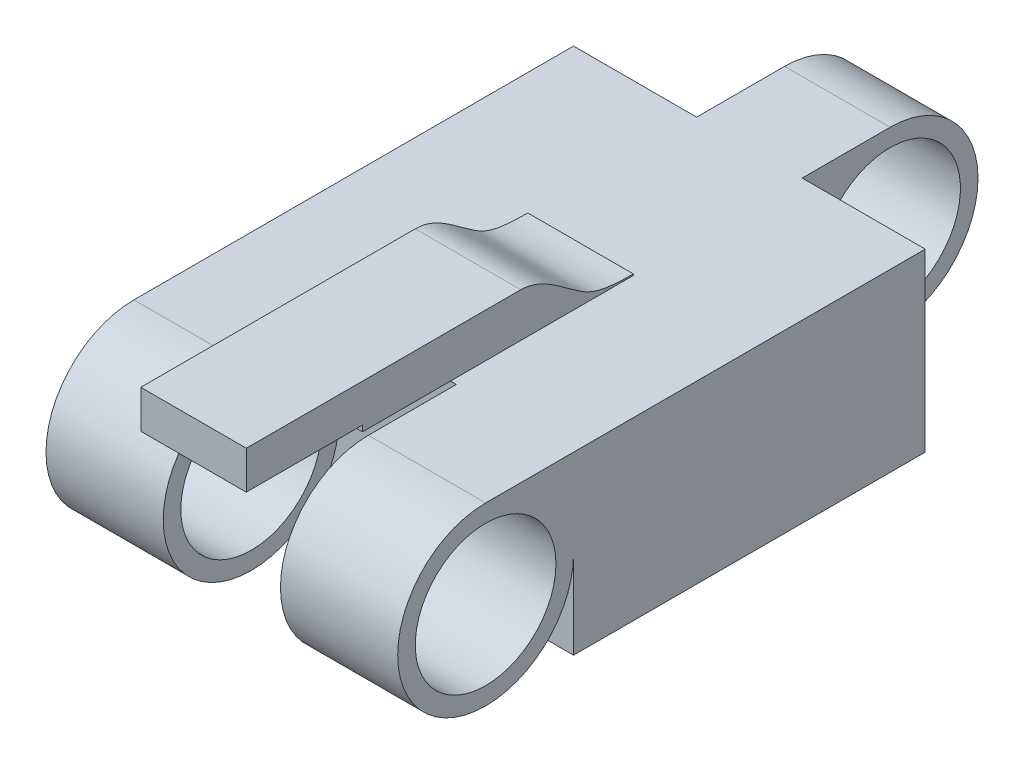
ISO-10303-21;
HEADER;
FILE_DESCRIPTION(('STEP AP214'),'2;1');
FILE_NAME('part.step','',(''),(''),'','','');
FILE_SCHEMA(('AUTOMOTIVE_DESIGN { 1 0 10303 214 1 1 1 1 }'));
ENDSEC;
DATA;
#1=APPLICATION_CONTEXT('core data for automotive mechanical design processes');
#2=APPLICATION_PROTOCOL_DEFINITION('international standard','automotive_design',2000,#1);
#3=PRODUCT_CONTEXT('',#1,'mechanical');
#4=PRODUCT('Part','Part','',(#3));
#5=PRODUCT_RELATED_PRODUCT_CATEGORY('part','',(#4));
#6=PRODUCT_DEFINITION_FORMATION('','',#4);
#7=PRODUCT_DEFINITION_CONTEXT('part definition',#1,'design');
#8=PRODUCT_DEFINITION('design','',#6,#7);
#9=PRODUCT_DEFINITION_SHAPE('','',#8);
#10=(LENGTH_UNIT() NAMED_UNIT(*) SI_UNIT(.MILLI.,.METRE.));
#11=(NAMED_UNIT(*) PLANE_ANGLE_UNIT() SI_UNIT($,.RADIAN.));
#12=(NAMED_UNIT(*) SI_UNIT($,.STERADIAN.) SOLID_ANGLE_UNIT());
#13=UNCERTAINTY_MEASURE_WITH_UNIT(LENGTH_MEASURE(1.E-05),#10,'distance_accuracy_value','');
#14=(GEOMETRIC_REPRESENTATION_CONTEXT(3) GLOBAL_UNCERTAINTY_ASSIGNED_CONTEXT((#13)) GLOBAL_UNIT_ASSIGNED_CONTEXT((#10,
#11,#12)) REPRESENTATION_CONTEXT('',''));
#15=CARTESIAN_POINT('',(0.,0.,0.));
#16=DIRECTION('',(0.,0.,1.));
#17=DIRECTION('',(1.,0.,0.));
#18=AXIS2_PLACEMENT_3D('',#15,#16,#17);
#19=CARTESIAN_POINT('',(10.,0.,-10.));
#20=DIRECTION('',(0.,0.,1.));
#21=DIRECTION('',(1.,0.,0.));
#22=AXIS2_PLACEMENT_3D('',#19,#20,#21);
#23=PLANE('',#22);
#24=DIRECTION('',(0.,1.,0.));
#25=VECTOR('',#24,1.);
#26=CARTESIAN_POINT('',(6.5,5.,-10.));
#27=LINE('',#26,#25);
#28=CARTESIAN_POINT('',(6.5,2.5,-10.));
#29=VERTEX_POINT('',#28);
#30=CARTESIAN_POINT('',(6.5,5.,-10.));
#31=VERTEX_POINT('',#30);
#32=EDGE_CURVE('E401',#29,#31,#27,.T.);
#33=ORIENTED_EDGE('',*,*,#32,.T.);
#34=DIRECTION('',(-1.,0.,0.));
#35=VECTOR('',#34,1.);
#36=CARTESIAN_POINT('',(10.,5.,-10.));
#37=LINE('',#36,#35);
#38=CARTESIAN_POINT('',(10.,5.,-10.));
#39=VERTEX_POINT('',#38);
#40=EDGE_CURVE('E352',#39,#31,#37,.T.);
#41=ORIENTED_EDGE('',*,*,#40,.F.);
#42=DIRECTION('',(0.,1.,0.));
#43=VECTOR('',#42,1.);
#44=CARTESIAN_POINT('',(10.,0.,-10.));
#45=LINE('',#44,#43);
#46=CARTESIAN_POINT('',(10.,0.,-10.));
#47=VERTEX_POINT('',#46);
#48=EDGE_CURVE('E350',#47,#39,#45,.T.);
#49=ORIENTED_EDGE('',*,*,#48,.F.);
#50=DIRECTION('',(-1.,0.,0.));
#51=VECTOR('',#50,1.);
#52=CARTESIAN_POINT('',(10.,0.,-10.));
#53=LINE('',#52,#51);
#54=CARTESIAN_POINT('',(0.,0.,-10.));
#55=VERTEX_POINT('',#54);
#56=EDGE_CURVE('E53',#47,#55,#53,.T.);
#57=ORIENTED_EDGE('',*,*,#56,.T.);
#58=DIRECTION('',(0.,1.,0.));
#59=VECTOR('',#58,1.);
#60=CARTESIAN_POINT('',(0.,0.,-10.));
#61=LINE('',#60,#59);
#62=CARTESIAN_POINT('',(0.,5.,-10.));
#63=VERTEX_POINT('',#62);
#64=EDGE_CURVE('E342',#55,#63,#61,.T.);
#65=ORIENTED_EDGE('',*,*,#64,.T.);
#66=CARTESIAN_POINT('',(3.5,5.,-10.));
#67=VERTEX_POINT('',#66);
#68=EDGE_CURVE('E367',#67,#63,#37,.T.);
#69=ORIENTED_EDGE('',*,*,#68,.F.);
#70=DIRECTION('',(0.,1.,0.));
#71=VECTOR('',#70,1.);
#72=CARTESIAN_POINT('',(3.5,5.,-10.));
#73=LINE('',#72,#71);
#74=CARTESIAN_POINT('',(3.5,2.5,-10.));
#75=VERTEX_POINT('',#74);
#76=EDGE_CURVE('E381',#75,#67,#73,.T.);
#77=ORIENTED_EDGE('',*,*,#76,.F.);
#78=DIRECTION('',(-1.,0.,0.));
#79=VECTOR('',#78,1.);
#80=CARTESIAN_POINT('',(6.5,2.5,-10.));
#81=LINE('',#80,#79);
#82=EDGE_CURVE('E382',#29,#75,#81,.T.);
#83=ORIENTED_EDGE('',*,*,#82,.F.);
#84=EDGE_LOOP('',(#33,#41,#49,#57,#65,#69,#77,#83));
#85=FACE_BOUND('',#84,.T.);
#86=ADVANCED_FACE('F44',(#85),#23,.F.);
#87=CARTESIAN_POINT('',(10.,0.,0.));
#88=DIRECTION('',(0.,0.,-1.));
#89=DIRECTION('',(-1.,0.,0.));
#90=AXIS2_PLACEMENT_3D('',#87,#88,#89);
#91=PLANE('',#90);
#92=DIRECTION('',(1.,0.,0.));
#93=VECTOR('',#92,1.);
#94=CARTESIAN_POINT('',(6.66666666666667,2.5,0.));
#95=LINE('',#94,#93);
#96=CARTESIAN_POINT('',(6.66666666666667,2.5,0.));
#97=VERTEX_POINT('',#96);
#98=CARTESIAN_POINT('',(10.,2.5,0.));
#99=VERTEX_POINT('',#98);
#100=EDGE_CURVE('E437',#97,#99,#95,.T.);
#101=ORIENTED_EDGE('',*,*,#100,.F.);
#102=DIRECTION('',(0.,1.,0.));
#103=VECTOR('',#102,1.);
#104=CARTESIAN_POINT('',(6.66666666666667,5.,0.));
#105=LINE('',#104,#103);
#106=CARTESIAN_POINT('',(6.66666666666667,5.,0.));
#107=VERTEX_POINT('',#106);
#108=EDGE_CURVE('E429',#97,#107,#105,.T.);
#109=ORIENTED_EDGE('',*,*,#108,.T.);
#110=DIRECTION('',(-1.,0.,0.));
#111=VECTOR('',#110,1.);
#112=CARTESIAN_POINT('',(10.,5.,0.));
#113=LINE('',#112,#111);
#114=CARTESIAN_POINT('',(6.5,5.,0.));
#115=VERTEX_POINT('',#114);
#116=EDGE_CURVE('E363',#107,#115,#113,.T.);
#117=ORIENTED_EDGE('',*,*,#116,.T.);
#118=CARTESIAN_POINT('',(3.5,5.,0.));
#119=VERTEX_POINT('',#118);
#120=EDGE_CURVE('E368',#115,#119,#113,.T.);
#121=ORIENTED_EDGE('',*,*,#120,.T.);
#122=CARTESIAN_POINT('',(3.33333333333333,5.,0.));
#123=VERTEX_POINT('',#122);
#124=EDGE_CURVE('E369',#119,#123,#113,.T.);
#125=ORIENTED_EDGE('',*,*,#124,.T.);
#126=DIRECTION('',(0.,-1.,0.));
#127=VECTOR('',#126,1.);
#128=CARTESIAN_POINT('',(3.33333333333333,5.,0.));
#129=LINE('',#128,#127);
#130=CARTESIAN_POINT('',(3.33333333333333,2.5,0.));
#131=VERTEX_POINT('',#130);
#132=EDGE_CURVE('E464',#123,#131,#129,.T.);
#133=ORIENTED_EDGE('',*,*,#132,.T.);
#134=DIRECTION('',(-1.,0.,0.));
#135=VECTOR('',#134,1.);
#136=CARTESIAN_POINT('',(3.33333333333333,2.5,0.));
#137=LINE('',#136,#135);
#138=CARTESIAN_POINT('',(0.,2.5,0.));
#139=VERTEX_POINT('',#138);
#140=EDGE_CURVE('E470',#131,#139,#137,.T.);
#141=ORIENTED_EDGE('',*,*,#140,.T.);
#142=DIRECTION('',(0.,-1.,0.));
#143=VECTOR('',#142,1.);
#144=CARTESIAN_POINT('',(0.,0.,0.));
#145=LINE('',#144,#143);
#146=CARTESIAN_POINT('',(0.,0.,0.));
#147=VERTEX_POINT('',#146);
#148=EDGE_CURVE('E343',#139,#147,#145,.T.);
#149=ORIENTED_EDGE('',*,*,#148,.T.);
#150=DIRECTION('',(-1.,0.,0.));
#151=VECTOR('',#150,1.);
#152=CARTESIAN_POINT('',(10.,0.,0.));
#153=LINE('',#152,#151);
#154=CARTESIAN_POINT('',(10.,0.,0.));
#155=VERTEX_POINT('',#154);
#156=EDGE_CURVE('E11',#155,#147,#153,.T.);
#157=ORIENTED_EDGE('',*,*,#156,.F.);
#158=DIRECTION('',(0.,-1.,0.));
#159=VECTOR('',#158,1.);
#160=CARTESIAN_POINT('',(10.,0.,0.));
#161=LINE('',#160,#159);
#162=EDGE_CURVE('E359',#99,#155,#161,.T.);
#163=ORIENTED_EDGE('',*,*,#162,.F.);
#164=EDGE_LOOP('',(#101,#109,#117,#121,#125,#133,#141,#149,#157,#163));
#165=FACE_BOUND('',#164,.T.);
#166=ADVANCED_FACE('F46',(#165),#91,.F.);
#167=CARTESIAN_POINT('',(10.,0.,0.));
#168=DIRECTION('',(0.,1.,0.));
#169=DIRECTION('',(0.,0.,1.));
#170=AXIS2_PLACEMENT_3D('',#167,#168,#169);
#171=PLANE('',#170);
#172=DIRECTION('',(0.,0.,-1.));
#173=VECTOR('',#172,1.);
#174=CARTESIAN_POINT('',(0.,0.,0.));
#175=LINE('',#174,#173);
#176=EDGE_CURVE('E335',#147,#55,#175,.T.);
#177=ORIENTED_EDGE('',*,*,#176,.T.);
#178=ORIENTED_EDGE('',*,*,#56,.F.);
#179=DIRECTION('',(0.,0.,-1.));
#180=VECTOR('',#179,1.);
#181=CARTESIAN_POINT('',(10.,0.,0.));
#182=LINE('',#181,#180);
#183=EDGE_CURVE('E478',#155,#47,#182,.T.);
#184=ORIENTED_EDGE('',*,*,#183,.F.);
#185=ORIENTED_EDGE('',*,*,#156,.T.);
#186=EDGE_LOOP('',(#177,#178,#184,#185));
#187=FACE_BOUND('',#186,.T.);
#188=ADVANCED_FACE('F324',(#187),#171,.F.);
#189=CARTESIAN_POINT('',(10.,5.,0.));
#190=DIRECTION('',(0.,-1.,0.));
#191=DIRECTION('',(0.,0.,-1.));
#192=AXIS2_PLACEMENT_3D('',#189,#190,#191);
#193=PLANE('',#192);
#194=DIRECTION('',(-1.,0.,0.));
#195=VECTOR('',#194,1.);
#196=CARTESIAN_POINT('',(6.5,5.,-5.2));
#197=LINE('',#196,#195);
#198=CARTESIAN_POINT('',(6.5,5.,-5.2));
#199=VERTEX_POINT('',#198);
#200=CARTESIAN_POINT('',(3.5,5.,-5.2));
#201=VERTEX_POINT('',#200);
#202=EDGE_CURVE('E68',#199,#201,#197,.T.);
#203=ORIENTED_EDGE('',*,*,#202,.F.);
#204=DIRECTION('',(0.,0.,1.));
#205=VECTOR('',#204,1.);
#206=CARTESIAN_POINT('',(6.5,5.,8.));
#207=LINE('',#206,#205);
#208=EDGE_CURVE('E241',#199,#115,#207,.T.);
#209=ORIENTED_EDGE('',*,*,#208,.T.);
#210=ORIENTED_EDGE('',*,*,#116,.F.);
#211=DIRECTION('',(0.,0.,1.));
#212=VECTOR('',#211,1.);
#213=CARTESIAN_POINT('',(6.66666666666667,5.,2.5));
#214=LINE('',#213,#212);
#215=CARTESIAN_POINT('',(6.66666666666667,5.,2.5));
#216=VERTEX_POINT('',#215);
#217=EDGE_CURVE('E433',#107,#216,#214,.T.);
#218=ORIENTED_EDGE('',*,*,#217,.T.);
#219=DIRECTION('',(1.,0.,0.));
#220=VECTOR('',#219,1.);
#221=CARTESIAN_POINT('',(6.66666666666667,5.,2.5));
#222=LINE('',#221,#220);
#223=CARTESIAN_POINT('',(10.,5.,2.5));
#224=VERTEX_POINT('',#223);
#225=EDGE_CURVE('E440',#216,#224,#222,.T.);
#226=ORIENTED_EDGE('',*,*,#225,.T.);
#227=DIRECTION('',(0.,0.,1.));
#228=VECTOR('',#227,1.);
#229=CARTESIAN_POINT('',(10.,5.,0.));
#230=LINE('',#229,#228);
#231=EDGE_CURVE('E483',#39,#224,#230,.T.);
#232=ORIENTED_EDGE('',*,*,#231,.F.);
#233=ORIENTED_EDGE('',*,*,#40,.T.);
#234=DIRECTION('',(0.,0.,-1.));
#235=VECTOR('',#234,1.);
#236=CARTESIAN_POINT('',(6.5,5.,-12.5));
#237=LINE('',#236,#235);
#238=CARTESIAN_POINT('',(6.5,5.,-12.5));
#239=VERTEX_POINT('',#238);
#240=EDGE_CURVE('E404',#31,#239,#237,.T.);
#241=ORIENTED_EDGE('',*,*,#240,.T.);
#242=DIRECTION('',(-1.,0.,0.));
#243=VECTOR('',#242,1.);
#244=CARTESIAN_POINT('',(6.5,5.,-12.5));
#245=LINE('',#244,#243);
#246=CARTESIAN_POINT('',(3.5,5.,-12.5));
#247=VERTEX_POINT('',#246);
#248=EDGE_CURVE('E411',#239,#247,#245,.T.);
#249=ORIENTED_EDGE('',*,*,#248,.T.);
#250=DIRECTION('',(0.,0.,-1.));
#251=VECTOR('',#250,1.);
#252=CARTESIAN_POINT('',(3.5,5.,-12.5));
#253=LINE('',#252,#251);
#254=EDGE_CURVE('E378',#67,#247,#253,.T.);
#255=ORIENTED_EDGE('',*,*,#254,.F.);
#256=ORIENTED_EDGE('',*,*,#68,.T.);
#257=DIRECTION('',(0.,0.,1.));
#258=VECTOR('',#257,1.);
#259=CARTESIAN_POINT('',(0.,5.,0.));
#260=LINE('',#259,#258);
#261=CARTESIAN_POINT('',(0.,5.,2.5));
#262=VERTEX_POINT('',#261);
#263=EDGE_CURVE('E355',#63,#262,#260,.T.);
#264=ORIENTED_EDGE('',*,*,#263,.T.);
#265=DIRECTION('',(-1.,0.,0.));
#266=VECTOR('',#265,1.);
#267=CARTESIAN_POINT('',(3.33333333333333,5.,2.5));
#268=LINE('',#267,#266);
#269=CARTESIAN_POINT('',(3.33333333333333,5.,2.5));
#270=VERTEX_POINT('',#269);
#271=EDGE_CURVE('E467',#270,#262,#268,.T.);
#272=ORIENTED_EDGE('',*,*,#271,.F.);
#273=DIRECTION('',(0.,0.,-1.));
#274=VECTOR('',#273,1.);
#275=CARTESIAN_POINT('',(3.33333333333333,5.,2.5));
#276=LINE('',#275,#274);
#277=EDGE_CURVE('E460',#270,#123,#276,.T.);
#278=ORIENTED_EDGE('',*,*,#277,.T.);
#279=ORIENTED_EDGE('',*,*,#124,.F.);
#280=DIRECTION('',(0.,0.,1.));
#281=VECTOR('',#280,1.);
#282=CARTESIAN_POINT('',(3.5,5.,8.));
#283=LINE('',#282,#281);
#284=EDGE_CURVE('E220',#201,#119,#283,.T.);
#285=ORIENTED_EDGE('',*,*,#284,.F.);
#286=EDGE_LOOP('',(#203,#209,#210,#218,#226,#232,#233,#241,#249,#255,#256,#264,#272,#278,#279,#285));
#287=FACE_BOUND('',#286,.T.);
#288=ADVANCED_FACE('F317',(#287),#193,.F.);
#289=CARTESIAN_POINT('',(10.,0.,0.));
#290=DIRECTION('',(-1.,0.,0.));
#291=DIRECTION('',(0.,0.,1.));
#292=AXIS2_PLACEMENT_3D('',#289,#290,#291);
#293=PLANE('',#292);
#294=ORIENTED_EDGE('',*,*,#231,.T.);
#295=CARTESIAN_POINT('',(10.,2.5,2.5));
#296=DIRECTION('',(1.,0.,0.));
#297=DIRECTION('',(0.,0.,-1.));
#298=AXIS2_PLACEMENT_3D('',#295,#296,#297);
#299=CIRCLE('',#298,2.5);
#300=EDGE_CURVE('E421',#224,#99,#299,.T.);
#301=ORIENTED_EDGE('',*,*,#300,.T.);
#302=ORIENTED_EDGE('',*,*,#162,.T.);
#303=ORIENTED_EDGE('',*,*,#183,.T.);
#304=ORIENTED_EDGE('',*,*,#48,.T.);
#305=EDGE_LOOP('',(#294,#301,#302,#303,#304));
#306=FACE_BOUND('',#305,.T.);
#307=CARTESIAN_POINT('',(10.,2.5,2.5));
#308=DIRECTION('',(1.,0.,0.));
#309=DIRECTION('',(0.,0.,-1.));
#310=AXIS2_PLACEMENT_3D('',#307,#308,#309);
#311=CIRCLE('',#310,2.);
#312=CARTESIAN_POINT('',(10.,2.5,0.5));
#313=VERTEX_POINT('',#312);
#314=EDGE_CURVE('E414',#313,#313,#311,.T.);
#315=ORIENTED_EDGE('',*,*,#314,.F.);
#316=EDGE_LOOP('',(#315));
#317=FACE_BOUND('',#316,.T.);
#318=ADVANCED_FACE('F314',(#306,#317),#293,.F.);
#319=CARTESIAN_POINT('',(0.,0.,0.));
#320=DIRECTION('',(-1.,0.,0.));
#321=DIRECTION('',(0.,0.,1.));
#322=AXIS2_PLACEMENT_3D('',#319,#320,#321);
#323=PLANE('',#322);
#324=ORIENTED_EDGE('',*,*,#148,.F.);
#325=CARTESIAN_POINT('',(0.,2.5,2.5));
#326=DIRECTION('',(-1.,0.,0.));
#327=DIRECTION('',(0.,0.,1.));
#328=AXIS2_PLACEMENT_3D('',#325,#326,#327);
#329=CIRCLE('',#328,2.5);
#330=EDGE_CURVE('E452',#139,#262,#329,.T.);
#331=ORIENTED_EDGE('',*,*,#330,.T.);
#332=ORIENTED_EDGE('',*,*,#263,.F.);
#333=ORIENTED_EDGE('',*,*,#64,.F.);
#334=ORIENTED_EDGE('',*,*,#176,.F.);
#335=EDGE_LOOP('',(#324,#331,#332,#333,#334));
#336=FACE_BOUND('',#335,.T.);
#337=CARTESIAN_POINT('',(0.,2.5,2.5));
#338=DIRECTION('',(-1.,0.,0.));
#339=DIRECTION('',(0.,0.,1.));
#340=AXIS2_PLACEMENT_3D('',#337,#338,#339);
#341=CIRCLE('',#340,2.);
#342=CARTESIAN_POINT('',(0.,2.5,4.5));
#343=VERTEX_POINT('',#342);
#344=EDGE_CURVE('E444',#343,#343,#341,.T.);
#345=ORIENTED_EDGE('',*,*,#344,.F.);
#346=EDGE_LOOP('',(#345));
#347=FACE_BOUND('',#346,.T.);
#348=ADVANCED_FACE('F312',(#336,#347),#323,.T.);
#349=CARTESIAN_POINT('',(3.33333333333333,2.5,2.5));
#350=DIRECTION('',(-1.,0.,0.));
#351=DIRECTION('',(0.,0.,1.));
#352=AXIS2_PLACEMENT_3D('',#349,#350,#351);
#353=CYLINDRICAL_SURFACE('',#352,2.5);
#354=ORIENTED_EDGE('',*,*,#330,.F.);
#355=ORIENTED_EDGE('',*,*,#140,.F.);
#356=CARTESIAN_POINT('',(3.33333333333333,2.5,2.5));
#357=DIRECTION('',(-1.,0.,0.));
#358=DIRECTION('',(0.,0.,1.));
#359=AXIS2_PLACEMENT_3D('',#356,#357,#358);
#360=CIRCLE('',#359,2.5);
#361=EDGE_CURVE('E456',#131,#270,#360,.T.);
#362=ORIENTED_EDGE('',*,*,#361,.T.);
#363=ORIENTED_EDGE('',*,*,#271,.T.);
#364=EDGE_LOOP('',(#354,#355,#362,#363));
#365=FACE_BOUND('',#364,.T.);
#366=ADVANCED_FACE('F308',(#365),#353,.T.);
#367=CARTESIAN_POINT('',(3.33333333333333,2.5,2.5));
#368=DIRECTION('',(-1.,0.,0.));
#369=DIRECTION('',(0.,0.,1.));
#370=AXIS2_PLACEMENT_3D('',#367,#368,#369);
#371=PLANE('',#370);
#372=CARTESIAN_POINT('',(3.33333333333333,2.5,2.5));
#373=DIRECTION('',(-1.,0.,0.));
#374=DIRECTION('',(0.,0.,1.));
#375=AXIS2_PLACEMENT_3D('',#372,#373,#374);
#376=CIRCLE('',#375,2.);
#377=CARTESIAN_POINT('',(3.33333333333333,2.5,4.5));
#378=VERTEX_POINT('',#377);
#379=EDGE_CURVE('E448',#378,#378,#376,.T.);
#380=ORIENTED_EDGE('',*,*,#379,.T.);
#381=EDGE_LOOP('',(#380));
#382=FACE_BOUND('',#381,.T.);
#383=ORIENTED_EDGE('',*,*,#361,.F.);
#384=ORIENTED_EDGE('',*,*,#132,.F.);
#385=ORIENTED_EDGE('',*,*,#277,.F.);
#386=EDGE_LOOP('',(#383,#384,#385));
#387=FACE_BOUND('',#386,.T.);
#388=ADVANCED_FACE('F304',(#382,#387),#371,.F.);
#389=CARTESIAN_POINT('',(3.33333333333333,2.5,2.5));
#390=DIRECTION('',(-1.,0.,0.));
#391=DIRECTION('',(0.,0.,1.));
#392=AXIS2_PLACEMENT_3D('',#389,#390,#391);
#393=CYLINDRICAL_SURFACE('',#392,2.);
#394=CARTESIAN_POINT('',(3.33333333333333,2.5,4.5));
#395=CARTESIAN_POINT('',(3.29861111111111,2.5,4.5));
#396=CARTESIAN_POINT('',(3.26388888888889,2.5,4.5));
#397=CARTESIAN_POINT('',(3.19444444444444,2.5,4.5));
#398=CARTESIAN_POINT('',(3.15972222222222,2.5,4.5));
#399=CARTESIAN_POINT('',(3.09027777777778,2.5,4.5));
#400=CARTESIAN_POINT('',(3.05555555555556,2.5,4.5));
#401=CARTESIAN_POINT('',(2.98611111111111,2.5,4.5));
#402=CARTESIAN_POINT('',(2.95138888888889,2.5,4.5));
#403=CARTESIAN_POINT('',(2.88194444444444,2.5,4.5));
#404=CARTESIAN_POINT('',(2.84722222222222,2.5,4.5));
#405=CARTESIAN_POINT('',(2.77777777777778,2.5,4.5));
#406=CARTESIAN_POINT('',(2.74305555555556,2.5,4.5));
#407=CARTESIAN_POINT('',(2.67361111111111,2.5,4.5));
#408=CARTESIAN_POINT('',(2.63888888888889,2.5,4.5));
#409=CARTESIAN_POINT('',(2.56944444444444,2.5,4.5));
#410=CARTESIAN_POINT('',(2.53472222222222,2.5,4.5));
#411=CARTESIAN_POINT('',(2.46527777777778,2.5,4.5));
#412=CARTESIAN_POINT('',(2.43055555555556,2.5,4.5));
#413=CARTESIAN_POINT('',(2.36111111111111,2.5,4.5));
#414=CARTESIAN_POINT('',(2.32638888888889,2.5,4.5));
#415=CARTESIAN_POINT('',(2.25694444444444,2.5,4.5));
#416=CARTESIAN_POINT('',(2.22222222222222,2.5,4.5));
#417=CARTESIAN_POINT('',(2.15277777777778,2.5,4.5));
#418=CARTESIAN_POINT('',(2.11805555555556,2.5,4.5));
#419=CARTESIAN_POINT('',(2.04861111111111,2.5,4.5));
#420=CARTESIAN_POINT('',(2.01388888888889,2.5,4.5));
#421=CARTESIAN_POINT('',(1.94444444444445,2.5,4.5));
#422=CARTESIAN_POINT('',(1.90972222222222,2.5,4.5));
#423=CARTESIAN_POINT('',(1.84027777777778,2.5,4.5));
#424=CARTESIAN_POINT('',(1.80555555555556,2.5,4.5));
#425=CARTESIAN_POINT('',(1.73611111111111,2.5,4.5));
#426=CARTESIAN_POINT('',(1.70138888888889,2.5,4.5));
#427=CARTESIAN_POINT('',(1.63194444444444,2.5,4.5));
#428=CARTESIAN_POINT('',(1.59722222222222,2.5,4.5));
#429=CARTESIAN_POINT('',(1.52777777777778,2.5,4.5));
#430=CARTESIAN_POINT('',(1.49305555555556,2.5,4.5));
#431=CARTESIAN_POINT('',(1.42361111111111,2.5,4.5));
#432=CARTESIAN_POINT('',(1.38888888888889,2.5,4.5));
#433=CARTESIAN_POINT('',(1.31944444444444,2.5,4.5));
#434=CARTESIAN_POINT('',(1.28472222222222,2.5,4.5));
#435=CARTESIAN_POINT('',(1.21527777777778,2.5,4.5));
#436=CARTESIAN_POINT('',(1.18055555555556,2.5,4.5));
#437=CARTESIAN_POINT('',(1.11111111111111,2.5,4.5));
#438=CARTESIAN_POINT('',(1.07638888888889,2.5,4.5));
#439=CARTESIAN_POINT('',(1.00694444444444,2.5,4.5));
#440=CARTESIAN_POINT('',(0.972222222222223,2.5,4.5));
#441=CARTESIAN_POINT('',(0.902777777777778,2.5,4.5));
#442=CARTESIAN_POINT('',(0.868055555555556,2.5,4.5));
#443=CARTESIAN_POINT('',(0.798611111111112,2.5,4.5));
#444=CARTESIAN_POINT('',(0.763888888888889,2.5,4.5));
#445=CARTESIAN_POINT('',(0.694444444444445,2.5,4.5));
#446=CARTESIAN_POINT('',(0.659722222222223,2.5,4.5));
#447=CARTESIAN_POINT('',(0.590277777777778,2.5,4.5));
#448=CARTESIAN_POINT('',(0.555555555555556,2.5,4.5));
#449=CARTESIAN_POINT('',(0.486111111111112,2.5,4.5));
#450=CARTESIAN_POINT('',(0.451388888888889,2.5,4.5));
#451=CARTESIAN_POINT('',(0.381944444444445,2.5,4.5));
#452=CARTESIAN_POINT('',(0.347222222222223,2.5,4.5));
#453=CARTESIAN_POINT('',(0.277777777777778,2.5,4.5));
#454=CARTESIAN_POINT('',(0.243055555555556,2.5,4.5));
#455=CARTESIAN_POINT('',(0.173611111111111,2.5,4.5));
#456=CARTESIAN_POINT('',(0.138888888888889,2.5,4.5));
#457=CARTESIAN_POINT('',(0.0694444444444448,2.5,4.5));
#458=CARTESIAN_POINT('',(0.0347222222222226,2.5,4.5));
#459=CARTESIAN_POINT('',(0.,2.5,4.5));
#460=B_SPLINE_CURVE_WITH_KNOTS('',3,(#394,#395,#396,#397,#398,#399,#400,#401,#402,#403,#404,
#405,#406,#407,#408,#409,#410,#411,#412,#413,#414,#415,#416,#417,#418,#419,#420,#421,#422,#423,
#424,#425,#426,#427,#428,#429,#430,#431,#432,#433,#434,#435,#436,#437,#438,#439,#440,#441,#442,
#443,#444,#445,#446,#447,#448,#449,#450,#451,#452,#453,#454,#455,#456,#457,#458,#459),
.UNSPECIFIED.,.F.,.F.,(4,2,2,2,2,2,2,2,2,2,2,2,2,2,2,2,2,2,2,2,2,2,2,2,2,2,2,2,2,2,2,2,4),(0.,
0.104166666666666,0.208333333333333,0.3125,0.416666666666666,0.520833333333333,0.625,
0.729166666666666,0.833333333333333,0.9375,1.04166666666667,1.14583333333333,1.25,
1.35416666666667,1.45833333333333,1.5625,1.66666666666667,1.77083333333333,1.875,
1.97916666666667,2.08333333333333,2.1875,2.29166666666667,2.39583333333333,2.5,2.60416666666667,
2.70833333333333,2.8125,2.91666666666667,3.02083333333333,3.125,3.22916666666667,
3.33333333333333),.UNSPECIFIED.);
#461=EDGE_CURVE('BSEAM300',#378,#343,#460,.T.);
#462=ORIENTED_EDGE('',*,*,#379,.F.);
#463=ORIENTED_EDGE('',*,*,#344,.T.);
#464=ORIENTED_EDGE('',*,*,#461,.T.);
#465=ORIENTED_EDGE('',*,*,#461,.F.);
#466=EDGE_LOOP('',(#462,#464,#463,#465));
#467=FACE_BOUND('',#466,.T.);
#468=ADVANCED_FACE('F300',(#467),#393,.F.);
#469=CARTESIAN_POINT('',(6.66666666666667,2.5,2.5));
#470=DIRECTION('',(1.,0.,0.));
#471=DIRECTION('',(0.,0.,-1.));
#472=AXIS2_PLACEMENT_3D('',#469,#470,#471);
#473=CYLINDRICAL_SURFACE('',#472,2.5);
#474=ORIENTED_EDGE('',*,*,#300,.F.);
#475=ORIENTED_EDGE('',*,*,#225,.F.);
#476=CARTESIAN_POINT('',(6.66666666666667,2.5,2.5));
#477=DIRECTION('',(1.,0.,0.));
#478=DIRECTION('',(0.,0.,-1.));
#479=AXIS2_PLACEMENT_3D('',#476,#477,#478);
#480=CIRCLE('',#479,2.5);
#481=EDGE_CURVE('E425',#216,#97,#480,.T.);
#482=ORIENTED_EDGE('',*,*,#481,.T.);
#483=ORIENTED_EDGE('',*,*,#100,.T.);
#484=EDGE_LOOP('',(#474,#475,#482,#483));
#485=FACE_BOUND('',#484,.T.);
#486=ADVANCED_FACE('F296',(#485),#473,.T.);
#487=CARTESIAN_POINT('',(6.66666666666667,2.5,2.5));
#488=DIRECTION('',(1.,0.,0.));
#489=DIRECTION('',(0.,0.,-1.));
#490=AXIS2_PLACEMENT_3D('',#487,#488,#489);
#491=PLANE('',#490);
#492=CARTESIAN_POINT('',(6.66666666666667,2.5,2.5));
#493=DIRECTION('',(1.,0.,0.));
#494=DIRECTION('',(0.,0.,-1.));
#495=AXIS2_PLACEMENT_3D('',#492,#493,#494);
#496=CIRCLE('',#495,2.);
#497=CARTESIAN_POINT('',(6.66666666666667,2.5,0.5));
#498=VERTEX_POINT('',#497);
#499=EDGE_CURVE('E417',#498,#498,#496,.T.);
#500=ORIENTED_EDGE('',*,*,#499,.T.);
#501=EDGE_LOOP('',(#500));
#502=FACE_BOUND('',#501,.T.);
#503=ORIENTED_EDGE('',*,*,#481,.F.);
#504=ORIENTED_EDGE('',*,*,#217,.F.);
#505=ORIENTED_EDGE('',*,*,#108,.F.);
#506=EDGE_LOOP('',(#503,#504,#505));
#507=FACE_BOUND('',#506,.T.);
#508=ADVANCED_FACE('F292',(#502,#507),#491,.F.);
#509=CARTESIAN_POINT('',(6.66666666666667,2.5,2.5));
#510=DIRECTION('',(1.,0.,0.));
#511=DIRECTION('',(0.,0.,-1.));
#512=AXIS2_PLACEMENT_3D('',#509,#510,#511);
#513=CYLINDRICAL_SURFACE('',#512,2.);
#514=CARTESIAN_POINT('',(6.66666666666667,2.5,0.5));
#515=CARTESIAN_POINT('',(6.70138888888889,2.5,0.5));
#516=CARTESIAN_POINT('',(6.73611111111111,2.5,0.5));
#517=CARTESIAN_POINT('',(6.80555555555556,2.5,0.5));
#518=CARTESIAN_POINT('',(6.84027777777778,2.5,0.5));
#519=CARTESIAN_POINT('',(6.90972222222222,2.5,0.5));
#520=CARTESIAN_POINT('',(6.94444444444444,2.5,0.5));
#521=CARTESIAN_POINT('',(7.01388888888889,2.5,0.5));
#522=CARTESIAN_POINT('',(7.04861111111111,2.5,0.5));
#523=CARTESIAN_POINT('',(7.11805555555556,2.5,0.5));
#524=CARTESIAN_POINT('',(7.15277777777778,2.5,0.5));
#525=CARTESIAN_POINT('',(7.22222222222222,2.5,0.5));
#526=CARTESIAN_POINT('',(7.25694444444444,2.5,0.5));
#527=CARTESIAN_POINT('',(7.32638888888889,2.5,0.5));
#528=CARTESIAN_POINT('',(7.36111111111111,2.5,0.5));
#529=CARTESIAN_POINT('',(7.43055555555556,2.5,0.5));
#530=CARTESIAN_POINT('',(7.46527777777778,2.5,0.5));
#531=CARTESIAN_POINT('',(7.53472222222222,2.5,0.5));
#532=CARTESIAN_POINT('',(7.56944444444444,2.5,0.5));
#533=CARTESIAN_POINT('',(7.63888888888889,2.5,0.5));
#534=CARTESIAN_POINT('',(7.67361111111111,2.5,0.5));
#535=CARTESIAN_POINT('',(7.74305555555556,2.5,0.5));
#536=CARTESIAN_POINT('',(7.77777777777778,2.5,0.5));
#537=CARTESIAN_POINT('',(7.84722222222222,2.5,0.5));
#538=CARTESIAN_POINT('',(7.88194444444444,2.5,0.5));
#539=CARTESIAN_POINT('',(7.95138888888889,2.5,0.5));
#540=CARTESIAN_POINT('',(7.98611111111111,2.5,0.5));
#541=CARTESIAN_POINT('',(8.05555555555556,2.5,0.5));
#542=CARTESIAN_POINT('',(8.09027777777778,2.5,0.5));
#543=CARTESIAN_POINT('',(8.15972222222222,2.5,0.5));
#544=CARTESIAN_POINT('',(8.19444444444444,2.5,0.5));
#545=CARTESIAN_POINT('',(8.26388888888889,2.5,0.5));
#546=CARTESIAN_POINT('',(8.29861111111111,2.5,0.5));
#547=CARTESIAN_POINT('',(8.36805555555556,2.5,0.5));
#548=CARTESIAN_POINT('',(8.40277777777778,2.5,0.5));
#549=CARTESIAN_POINT('',(8.47222222222222,2.5,0.5));
#550=CARTESIAN_POINT('',(8.50694444444444,2.5,0.5));
#551=CARTESIAN_POINT('',(8.57638888888889,2.5,0.5));
#552=CARTESIAN_POINT('',(8.61111111111111,2.5,0.5));
#553=CARTESIAN_POINT('',(8.68055555555556,2.5,0.5));
#554=CARTESIAN_POINT('',(8.71527777777778,2.5,0.5));
#555=CARTESIAN_POINT('',(8.78472222222222,2.5,0.5));
#556=CARTESIAN_POINT('',(8.81944444444444,2.5,0.5));
#557=CARTESIAN_POINT('',(8.88888888888889,2.5,0.5));
#558=CARTESIAN_POINT('',(8.92361111111111,2.5,0.5));
#559=CARTESIAN_POINT('',(8.99305555555556,2.5,0.5));
#560=CARTESIAN_POINT('',(9.02777777777778,2.5,0.5));
#561=CARTESIAN_POINT('',(9.09722222222222,2.5,0.5));
#562=CARTESIAN_POINT('',(9.13194444444444,2.5,0.5));
#563=CARTESIAN_POINT('',(9.20138888888889,2.5,0.5));
#564=CARTESIAN_POINT('',(9.23611111111111,2.5,0.5));
#565=CARTESIAN_POINT('',(9.30555555555556,2.5,0.5));
#566=CARTESIAN_POINT('',(9.34027777777778,2.5,0.5));
#567=CARTESIAN_POINT('',(9.40972222222222,2.5,0.5));
#568=CARTESIAN_POINT('',(9.44444444444444,2.5,0.5));
#569=CARTESIAN_POINT('',(9.51388888888889,2.5,0.5));
#570=CARTESIAN_POINT('',(9.54861111111111,2.5,0.5));
#571=CARTESIAN_POINT('',(9.61805555555556,2.5,0.5));
#572=CARTESIAN_POINT('',(9.65277777777778,2.5,0.5));
#573=CARTESIAN_POINT('',(9.72222222222222,2.5,0.5));
#574=CARTESIAN_POINT('',(9.75694444444444,2.5,0.5));
#575=CARTESIAN_POINT('',(9.82638888888889,2.5,0.5));
#576=CARTESIAN_POINT('',(9.86111111111111,2.5,0.5));
#577=CARTESIAN_POINT('',(9.93055555555556,2.5,0.5));
#578=CARTESIAN_POINT('',(9.96527777777778,2.5,0.5));
#579=CARTESIAN_POINT('',(10.,2.5,0.5));
#580=B_SPLINE_CURVE_WITH_KNOTS('',3,(#514,#515,#516,#517,#518,#519,#520,#521,#522,#523,#524,
#525,#526,#527,#528,#529,#530,#531,#532,#533,#534,#535,#536,#537,#538,#539,#540,#541,#542,#543,
#544,#545,#546,#547,#548,#549,#550,#551,#552,#553,#554,#555,#556,#557,#558,#559,#560,#561,#562,
#563,#564,#565,#566,#567,#568,#569,#570,#571,#572,#573,#574,#575,#576,#577,#578,#579),
.UNSPECIFIED.,.F.,.F.,(4,2,2,2,2,2,2,2,2,2,2,2,2,2,2,2,2,2,2,2,2,2,2,2,2,2,2,2,2,2,2,2,4),(0.,
0.104166666666666,0.208333333333333,0.312499999999999,0.416666666666666,0.520833333333332,0.625,
0.729166666666666,0.833333333333333,0.9375,1.04166666666667,1.14583333333333,1.25,
1.35416666666667,1.45833333333333,1.5625,1.66666666666667,1.77083333333333,1.875,
1.97916666666667,2.08333333333333,2.1875,2.29166666666666,2.39583333333333,2.5,2.60416666666667,
2.70833333333333,2.8125,2.91666666666667,3.02083333333333,3.125,3.22916666666667,
3.33333333333333),.UNSPECIFIED.);
#581=EDGE_CURVE('BSEAM288',#498,#313,#580,.T.);
#582=ORIENTED_EDGE('',*,*,#499,.F.);
#583=ORIENTED_EDGE('',*,*,#314,.T.);
#584=ORIENTED_EDGE('',*,*,#581,.T.);
#585=ORIENTED_EDGE('',*,*,#581,.F.);
#586=EDGE_LOOP('',(#582,#584,#583,#585));
#587=FACE_BOUND('',#586,.T.);
#588=ADVANCED_FACE('F288',(#587),#513,.F.);
#589=CARTESIAN_POINT('',(6.5,2.5,-12.5));
#590=DIRECTION('',(-1.,0.,0.));
#591=DIRECTION('',(0.,0.,1.));
#592=AXIS2_PLACEMENT_3D('',#589,#590,#591);
#593=CYLINDRICAL_SURFACE('',#592,2.5);
#594=ORIENTED_EDGE('',*,*,#82,.T.);
#595=CARTESIAN_POINT('',(3.5,2.5,-12.5));
#596=DIRECTION('',(-1.,0.,0.));
#597=DIRECTION('',(0.,0.,1.));
#598=AXIS2_PLACEMENT_3D('',#595,#596,#597);
#599=CIRCLE('',#598,2.5);
#600=EDGE_CURVE('E389',#247,#75,#599,.T.);
#601=ORIENTED_EDGE('',*,*,#600,.F.);
#602=ORIENTED_EDGE('',*,*,#248,.F.);
#603=CARTESIAN_POINT('',(6.5,2.5,-12.5));
#604=DIRECTION('',(-1.,0.,0.));
#605=DIRECTION('',(0.,0.,1.));
#606=AXIS2_PLACEMENT_3D('',#603,#604,#605);
#607=CIRCLE('',#606,2.5);
#608=EDGE_CURVE('E407',#239,#29,#607,.T.);
#609=ORIENTED_EDGE('',*,*,#608,.T.);
#610=EDGE_LOOP('',(#594,#601,#602,#609));
#611=FACE_BOUND('',#610,.T.);
#612=ADVANCED_FACE('F284',(#611),#593,.T.);
#613=CARTESIAN_POINT('',(6.5,2.5,-12.5));
#614=DIRECTION('',(-1.,0.,0.));
#615=DIRECTION('',(0.,0.,1.));
#616=AXIS2_PLACEMENT_3D('',#613,#614,#615);
#617=PLANE('',#616);
#618=CARTESIAN_POINT('',(6.5,2.5,-12.5));
#619=DIRECTION('',(-1.,0.,0.));
#620=DIRECTION('',(0.,0.,1.));
#621=AXIS2_PLACEMENT_3D('',#618,#619,#620);
#622=CIRCLE('',#621,2.);
#623=CARTESIAN_POINT('',(6.5,2.5,-10.5));
#624=VERTEX_POINT('',#623);
#625=EDGE_CURVE('E397',#624,#624,#622,.T.);
#626=ORIENTED_EDGE('',*,*,#625,.T.);
#627=EDGE_LOOP('',(#626));
#628=FACE_BOUND('',#627,.T.);
#629=ORIENTED_EDGE('',*,*,#32,.F.);
#630=ORIENTED_EDGE('',*,*,#608,.F.);
#631=ORIENTED_EDGE('',*,*,#240,.F.);
#632=EDGE_LOOP('',(#629,#630,#631));
#633=FACE_BOUND('',#632,.T.);
#634=ADVANCED_FACE('F280',(#628,#633),#617,.F.);
#635=CARTESIAN_POINT('',(6.5,2.5,-12.5));
#636=DIRECTION('',(-1.,0.,0.));
#637=DIRECTION('',(0.,0.,1.));
#638=AXIS2_PLACEMENT_3D('',#635,#636,#637);
#639=CYLINDRICAL_SURFACE('',#638,2.);
#640=ORIENTED_EDGE('',*,*,#625,.F.);
#641=EDGE_LOOP('',(#640));
#642=FACE_BOUND('',#641,.T.);
#643=CARTESIAN_POINT('',(3.5,2.5,-12.5));
#644=DIRECTION('',(-1.,0.,0.));
#645=DIRECTION('',(0.,0.,1.));
#646=AXIS2_PLACEMENT_3D('',#643,#644,#645);
#647=CIRCLE('',#646,2.);
#648=CARTESIAN_POINT('',(3.5,2.5,-10.5));
#649=VERTEX_POINT('',#648);
#650=EDGE_CURVE('E385',#649,#649,#647,.T.);
#651=ORIENTED_EDGE('',*,*,#650,.T.);
#652=EDGE_LOOP('',(#651));
#653=FACE_BOUND('',#652,.T.);
#654=ADVANCED_FACE('F276',(#642,#653),#639,.F.);
#655=CARTESIAN_POINT('',(3.5,2.5,-12.5));
#656=DIRECTION('',(-1.,0.,0.));
#657=DIRECTION('',(0.,0.,1.));
#658=AXIS2_PLACEMENT_3D('',#655,#656,#657);
#659=PLANE('',#658);
#660=ORIENTED_EDGE('',*,*,#76,.T.);
#661=ORIENTED_EDGE('',*,*,#254,.T.);
#662=ORIENTED_EDGE('',*,*,#600,.T.);
#663=EDGE_LOOP('',(#660,#661,#662));
#664=FACE_BOUND('',#663,.T.);
#665=ORIENTED_EDGE('',*,*,#650,.F.);
#666=EDGE_LOOP('',(#665));
#667=FACE_BOUND('',#666,.T.);
#668=ADVANCED_FACE('F272',(#664,#667),#659,.T.);
#669=CARTESIAN_POINT('',(6.5,5.,0.));
#670=DIRECTION('',(0.,-1.,0.));
#671=DIRECTION('',(0.,0.,-1.));
#672=AXIS2_PLACEMENT_3D('',#669,#670,#671);
#673=PLANE('',#672);
#674=DIRECTION('',(-1.,0.,0.));
#675=VECTOR('',#674,1.);
#676=CARTESIAN_POINT('',(10.,5.,2.49999999999999));
#677=LINE('',#676,#675);
#678=CARTESIAN_POINT('',(6.5,5.,2.49999999999999));
#679=VERTEX_POINT('',#678);
#680=CARTESIAN_POINT('',(3.5,5.,2.49999999999999));
#681=VERTEX_POINT('',#680);
#682=EDGE_CURVE('E203',#679,#681,#677,.T.);
#683=ORIENTED_EDGE('',*,*,#682,.T.);
#684=EDGE_CURVE('E219',#119,#681,#283,.T.);
#685=ORIENTED_EDGE('',*,*,#684,.F.);
#686=ORIENTED_EDGE('',*,*,#120,.F.);
#687=EDGE_CURVE('E240',#115,#679,#207,.T.);
#688=ORIENTED_EDGE('',*,*,#687,.T.);
#689=EDGE_LOOP('',(#683,#685,#686,#688));
#690=FACE_BOUND('',#689,.T.);
#691=ADVANCED_FACE('F275',(#690),#673,.T.);
#692=CARTESIAN_POINT('',(6.5,5.,-5.2));
#693=DIRECTION('',(0.,0.,-1.));
#694=DIRECTION('',(-1.,0.,0.));
#695=AXIS2_PLACEMENT_3D('',#692,#693,#694);
#696=PLANE('',#695);
#697=ORIENTED_EDGE('',*,*,#202,.T.);
#698=DIRECTION('',(0.,-1.,0.));
#699=VECTOR('',#698,1.);
#700=CARTESIAN_POINT('',(3.5,5.,-5.2));
#701=LINE('',#700,#699);
#702=CARTESIAN_POINT('',(3.5,5.04,-5.2));
#703=VERTEX_POINT('',#702);
#704=EDGE_CURVE('E233',#703,#201,#701,.T.);
#705=ORIENTED_EDGE('',*,*,#704,.F.);
#706=DIRECTION('',(-1.,0.,0.));
#707=VECTOR('',#706,1.);
#708=CARTESIAN_POINT('',(6.5,5.04,-5.2));
#709=LINE('',#708,#707);
#710=CARTESIAN_POINT('',(6.5,5.04,-5.2));
#711=VERTEX_POINT('',#710);
#712=EDGE_CURVE('E507',#711,#703,#709,.T.);
#713=ORIENTED_EDGE('',*,*,#712,.F.);
#714=DIRECTION('',(0.,-1.,0.));
#715=VECTOR('',#714,1.);
#716=CARTESIAN_POINT('',(6.5,5.,-5.2));
#717=LINE('',#716,#715);
#718=EDGE_CURVE('E254',#711,#199,#717,.T.);
#719=ORIENTED_EDGE('',*,*,#718,.T.);
#720=EDGE_LOOP('',(#697,#705,#713,#719));
#721=FACE_BOUND('',#720,.T.);
#722=ADVANCED_FACE('F265',(#721),#696,.T.);
#723=CARTESIAN_POINT('',(6.5,6.25,-2.));
#724=CARTESIAN_POINT('',(6.5,6.25,-2.49491015710027));
#725=CARTESIAN_POINT('',(6.5,5.8102786867275,-3.05724125762002));
#726=CARTESIAN_POINT('',(6.5,5.24154657730708,-3.86651723155634));
#727=CARTESIAN_POINT('',(6.5,5.04000000000001,-4.16099532339927));
#728=CARTESIAN_POINT('',(6.5,5.04,-5.2));
#729=B_SPLINE_CURVE_WITH_KNOTS('',3,(#723,#724,#725,#726,#727,#728),.UNSPECIFIED.,.F.,.F.,(4,1,
1,4),(0.,0.415212535086655,0.515212535086655,1.),.UNSPECIFIED.);
#730=DIRECTION('',(-1.,0.,0.));
#731=VECTOR('',#730,1.);
#732=SURFACE_OF_LINEAR_EXTRUSION('',#729,#731);
#733=ORIENTED_EDGE('',*,*,#712,.T.);
#734=CARTESIAN_POINT('',(3.5,6.25,-2.));
#735=CARTESIAN_POINT('',(3.5,6.25,-2.49491015710027));
#736=CARTESIAN_POINT('',(3.5,5.8102786867275,-3.05724125762002));
#737=CARTESIAN_POINT('',(3.5,5.24154657730708,-3.86651723155634));
#738=CARTESIAN_POINT('',(3.5,5.04000000000001,-4.16099532339927));
#739=CARTESIAN_POINT('',(3.5,5.04,-5.2));
#740=B_SPLINE_CURVE_WITH_KNOTS('',3,(#734,#735,#736,#737,#738,#739),.UNSPECIFIED.,.F.,.F.,(4,1,
1,4),(0.,0.415212535086655,0.515212535086655,1.),.UNSPECIFIED.);
#741=CARTESIAN_POINT('',(3.5,6.25,-2.));
#742=VERTEX_POINT('',#741);
#743=EDGE_CURVE('E227',#742,#703,#740,.T.);
#744=ORIENTED_EDGE('',*,*,#743,.F.);
#745=DIRECTION('',(-1.,0.,0.));
#746=VECTOR('',#745,1.);
#747=CARTESIAN_POINT('',(6.5,6.25,-2.));
#748=LINE('',#747,#746);
#749=CARTESIAN_POINT('',(6.5,6.25,-2.));
#750=VERTEX_POINT('',#749);
#751=EDGE_CURVE('E511',#750,#742,#748,.T.);
#752=ORIENTED_EDGE('',*,*,#751,.F.);
#753=EDGE_CURVE('E247',#750,#711,#729,.T.);
#754=ORIENTED_EDGE('',*,*,#753,.T.);
#755=EDGE_LOOP('',(#733,#744,#752,#754));
#756=FACE_BOUND('',#755,.T.);
#757=ADVANCED_FACE('F260',(#756),#732,.T.);
#758=CARTESIAN_POINT('',(6.5,6.25,-2.));
#759=DIRECTION('',(0.,1.,0.));
#760=DIRECTION('',(0.,0.,1.));
#761=AXIS2_PLACEMENT_3D('',#758,#759,#760);
#762=PLANE('',#761);
#763=DIRECTION('',(-1.,0.,0.));
#764=VECTOR('',#763,1.);
#765=CARTESIAN_POINT('',(10.,6.25,5.80529654609352));
#766=LINE('',#765,#764);
#767=CARTESIAN_POINT('',(6.5,6.25,5.80529654609352));
#768=VERTEX_POINT('',#767);
#769=CARTESIAN_POINT('',(3.5,6.25,5.80529654609352));
#770=VERTEX_POINT('',#769);
#771=EDGE_CURVE('E60',#768,#770,#766,.T.);
#772=ORIENTED_EDGE('',*,*,#771,.F.);
#773=DIRECTION('',(0.,0.,-1.));
#774=VECTOR('',#773,1.);
#775=CARTESIAN_POINT('',(6.5,6.25,-2.));
#776=LINE('',#775,#774);
#777=EDGE_CURVE('E244',#768,#750,#776,.T.);
#778=ORIENTED_EDGE('',*,*,#777,.T.);
#779=ORIENTED_EDGE('',*,*,#751,.T.);
#780=DIRECTION('',(0.,0.,-1.));
#781=VECTOR('',#780,1.);
#782=CARTESIAN_POINT('',(3.5,6.25,-2.));
#783=LINE('',#782,#781);
#784=EDGE_CURVE('E224',#770,#742,#783,.T.);
#785=ORIENTED_EDGE('',*,*,#784,.F.);
#786=EDGE_LOOP('',(#772,#778,#779,#785));
#787=FACE_BOUND('',#786,.T.);
#788=ADVANCED_FACE('F264',(#787),#762,.T.);
#789=CARTESIAN_POINT('',(6.5,5.48869822996648,-3.51497881884748));
#790=DIRECTION('',(1.,0.,0.));
#791=DIRECTION('',(0.,0.,-1.));
#792=AXIS2_PLACEMENT_3D('',#789,#790,#791);
#793=PLANE('',#792);
#794=DIRECTION('',(0.,1.,0.));
#795=VECTOR('',#794,1.);
#796=CARTESIAN_POINT('',(6.5,5.48869822996617,2.50000000000002));
#797=LINE('',#796,#795);
#798=CARTESIAN_POINT('',(6.5,5.16722678846601,2.5));
#799=VERTEX_POINT('',#798);
#800=EDGE_CURVE('E216',#679,#799,#797,.T.);
#801=ORIENTED_EDGE('',*,*,#800,.F.);
#802=ORIENTED_EDGE('',*,*,#687,.F.);
#803=ORIENTED_EDGE('',*,*,#208,.F.);
#804=ORIENTED_EDGE('',*,*,#718,.F.);
#805=ORIENTED_EDGE('',*,*,#753,.F.);
#806=ORIENTED_EDGE('',*,*,#777,.F.);
#807=DIRECTION('',(0.,1.,0.));
#808=VECTOR('',#807,1.);
#809=CARTESIAN_POINT('',(6.5,5.48869822996648,5.80529654609352));
#810=LINE('',#809,#808);
#811=CARTESIAN_POINT('',(6.5,5.16722678846601,5.80529654609352));
#812=VERTEX_POINT('',#811);
#813=EDGE_CURVE('E207',#812,#768,#810,.T.);
#814=ORIENTED_EDGE('',*,*,#813,.F.);
#815=DIRECTION('',(0.,0.,1.));
#816=VECTOR('',#815,1.);
#817=CARTESIAN_POINT('',(6.5,5.16722678846601,-3.51497881884748));
#818=LINE('',#817,#816);
#819=EDGE_CURVE('E184',#799,#812,#818,.T.);
#820=ORIENTED_EDGE('',*,*,#819,.F.);
#821=EDGE_LOOP('',(#801,#802,#803,#804,#805,#806,#814,#820));
#822=FACE_BOUND('',#821,.T.);
#823=ADVANCED_FACE('F270',(#822),#793,.T.);
#824=CARTESIAN_POINT('',(3.5,5.48869822996648,-3.51497881884748));
#825=DIRECTION('',(1.,0.,0.));
#826=DIRECTION('',(0.,0.,-1.));
#827=AXIS2_PLACEMENT_3D('',#824,#825,#826);
#828=PLANE('',#827);
#829=ORIENTED_EDGE('',*,*,#684,.T.);
#830=DIRECTION('',(0.,-1.,0.));
#831=VECTOR('',#830,1.);
#832=CARTESIAN_POINT('',(3.5,5.,2.49999999999999));
#833=LINE('',#832,#831);
#834=CARTESIAN_POINT('',(3.5,5.16722678846601,2.5));
#835=VERTEX_POINT('',#834);
#836=EDGE_CURVE('E197',#835,#681,#833,.T.);
#837=ORIENTED_EDGE('',*,*,#836,.F.);
#838=DIRECTION('',(0.,0.,-1.));
#839=VECTOR('',#838,1.);
#840=CARTESIAN_POINT('',(3.5,5.16722678846601,2.5));
#841=LINE('',#840,#839);
#842=CARTESIAN_POINT('',(3.5,5.16722678846601,5.80529654609352));
#843=VERTEX_POINT('',#842);
#844=EDGE_CURVE('E181',#843,#835,#841,.T.);
#845=ORIENTED_EDGE('',*,*,#844,.F.);
#846=DIRECTION('',(0.,-1.,0.));
#847=VECTOR('',#846,1.);
#848=CARTESIAN_POINT('',(3.5,6.25,5.80529654609352));
#849=LINE('',#848,#847);
#850=EDGE_CURVE('E189',#770,#843,#849,.T.);
#851=ORIENTED_EDGE('',*,*,#850,.F.);
#852=ORIENTED_EDGE('',*,*,#784,.T.);
#853=ORIENTED_EDGE('',*,*,#743,.T.);
#854=ORIENTED_EDGE('',*,*,#704,.T.);
#855=ORIENTED_EDGE('',*,*,#284,.T.);
#856=EDGE_LOOP('',(#829,#837,#845,#851,#852,#853,#854,#855));
#857=FACE_BOUND('',#856,.T.);
#858=ADVANCED_FACE('F196',(#857),#828,.F.);
#859=CARTESIAN_POINT('',(10.,5.,2.49999999999999));
#860=DIRECTION('',(0.,0.,-1.));
#861=DIRECTION('',(0.,1.,0.));
#862=AXIS2_PLACEMENT_3D('',#859,#860,#861);
#863=PLANE('',#862);
#864=ORIENTED_EDGE('',*,*,#800,.T.);
#865=DIRECTION('',(-1.,0.,0.));
#866=VECTOR('',#865,1.);
#867=CARTESIAN_POINT('',(10.,5.16722678846601,2.5));
#868=LINE('',#867,#866);
#869=EDGE_CURVE('E187',#799,#835,#868,.T.);
#870=ORIENTED_EDGE('',*,*,#869,.T.);
#871=ORIENTED_EDGE('',*,*,#836,.T.);
#872=ORIENTED_EDGE('',*,*,#682,.F.);
#873=EDGE_LOOP('',(#864,#870,#871,#872));
#874=FACE_BOUND('',#873,.T.);
#875=ADVANCED_FACE('F521',(#874),#863,.F.);
#876=CARTESIAN_POINT('',(10.,5.16722678846601,2.5));
#877=DIRECTION('',(0.,1.,0.));
#878=DIRECTION('',(0.,0.,1.));
#879=AXIS2_PLACEMENT_3D('',#876,#877,#878);
#880=PLANE('',#879);
#881=ORIENTED_EDGE('',*,*,#819,.T.);
#882=DIRECTION('',(-1.,0.,0.));
#883=VECTOR('',#882,1.);
#884=CARTESIAN_POINT('',(10.,5.16722678846601,5.80529654609352));
#885=LINE('',#884,#883);
#886=EDGE_CURVE('E177',#812,#843,#885,.T.);
#887=ORIENTED_EDGE('',*,*,#886,.T.);
#888=ORIENTED_EDGE('',*,*,#844,.T.);
#889=ORIENTED_EDGE('',*,*,#869,.F.);
#890=EDGE_LOOP('',(#881,#887,#888,#889));
#891=FACE_BOUND('',#890,.T.);
#892=ADVANCED_FACE('F178',(#891),#880,.F.);
#893=CARTESIAN_POINT('',(10.,6.25,5.80529654609352));
#894=DIRECTION('',(0.,0.,-1.));
#895=DIRECTION('',(-1.,0.,0.));
#896=AXIS2_PLACEMENT_3D('',#893,#894,#895);
#897=PLANE('',#896);
#898=ORIENTED_EDGE('',*,*,#813,.T.);
#899=ORIENTED_EDGE('',*,*,#771,.T.);
#900=ORIENTED_EDGE('',*,*,#850,.T.);
#901=ORIENTED_EDGE('',*,*,#886,.F.);
#902=EDGE_LOOP('',(#898,#899,#900,#901));
#903=FACE_BOUND('',#902,.T.);
#904=ADVANCED_FACE('F190',(#903),#897,.F.);
#905=CLOSED_SHELL('',(#86,#166,#188,#288,#318,#348,#366,#388,#468,#486,#508,#588,#612,#634,#654,
#668,#691,#722,#757,#788,#823,#858,#875,#892,#904));
#906=MANIFOLD_SOLID_BREP('B2',#905);
#907=ADVANCED_BREP_SHAPE_REPRESENTATION('',(#18,#906),#14);
#908=SHAPE_DEFINITION_REPRESENTATION(#9,#907);
ENDSEC;
END-ISO-10303-21;
